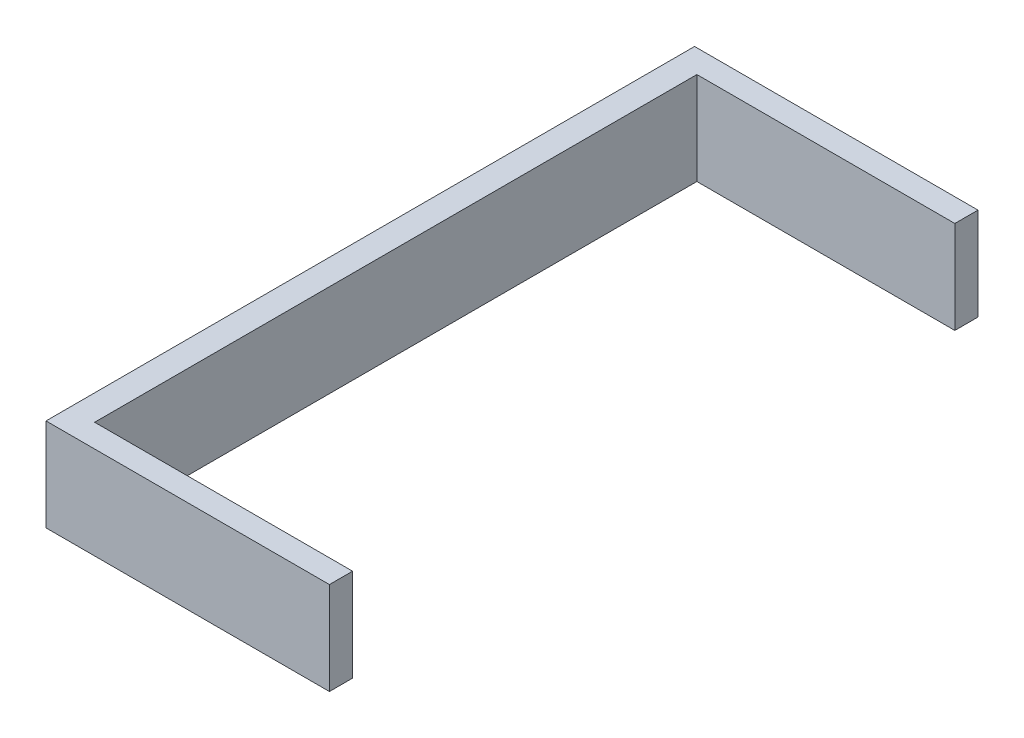
ISO-10303-21;
HEADER;
FILE_DESCRIPTION(('STEP AP214'),'2;1');
FILE_NAME('part.step','',(''),(''),'','','');
FILE_SCHEMA(('AUTOMOTIVE_DESIGN { 1 0 10303 214 1 1 1 1 }'));
ENDSEC;
DATA;
#1=APPLICATION_CONTEXT('core data for automotive mechanical design processes');
#2=APPLICATION_PROTOCOL_DEFINITION('international standard','automotive_design',2000,#1);
#3=PRODUCT_CONTEXT('',#1,'mechanical');
#4=PRODUCT('Part','Part','',(#3));
#5=PRODUCT_RELATED_PRODUCT_CATEGORY('part','',(#4));
#6=PRODUCT_DEFINITION_FORMATION('','',#4);
#7=PRODUCT_DEFINITION_CONTEXT('part definition',#1,'design');
#8=PRODUCT_DEFINITION('design','',#6,#7);
#9=PRODUCT_DEFINITION_SHAPE('','',#8);
#10=(LENGTH_UNIT() NAMED_UNIT(*) SI_UNIT(.MILLI.,.METRE.));
#11=(NAMED_UNIT(*) PLANE_ANGLE_UNIT() SI_UNIT($,.RADIAN.));
#12=(NAMED_UNIT(*) SI_UNIT($,.STERADIAN.) SOLID_ANGLE_UNIT());
#13=UNCERTAINTY_MEASURE_WITH_UNIT(LENGTH_MEASURE(1.E-05),#10,'distance_accuracy_value','');
#14=(GEOMETRIC_REPRESENTATION_CONTEXT(3) GLOBAL_UNCERTAINTY_ASSIGNED_CONTEXT((#13)) GLOBAL_UNIT_ASSIGNED_CONTEXT((#10,
#11,#12)) REPRESENTATION_CONTEXT('',''));
#15=CARTESIAN_POINT('',(0.,0.,0.));
#16=DIRECTION('',(0.,0.,1.));
#17=DIRECTION('',(1.,0.,0.));
#18=AXIS2_PLACEMENT_3D('',#15,#16,#17);
#19=CARTESIAN_POINT('',(35.3568,25.4,88.9));
#20=DIRECTION('',(-1.,0.,0.));
#21=DIRECTION('',(0.,0.,1.));
#22=AXIS2_PLACEMENT_3D('',#19,#20,#21);
#23=PLANE('',#22);
#24=DIRECTION('',(0.,0.,-1.));
#25=VECTOR('',#24,1.);
#26=CARTESIAN_POINT('',(35.3568,0.,88.9));
#27=LINE('',#26,#25);
#28=CARTESIAN_POINT('',(35.3568,0.,88.9));
#29=VERTEX_POINT('',#28);
#30=CARTESIAN_POINT('',(35.3568,0.,82.55));
#31=VERTEX_POINT('',#30);
#32=EDGE_CURVE('E129',#29,#31,#27,.T.);
#33=ORIENTED_EDGE('',*,*,#32,.T.);
#34=DIRECTION('',(0.,-1.,0.));
#35=VECTOR('',#34,1.);
#36=CARTESIAN_POINT('',(35.3568,25.4,82.55));
#37=LINE('',#36,#35);
#38=CARTESIAN_POINT('',(35.3568,25.4,82.55));
#39=VERTEX_POINT('',#38);
#40=EDGE_CURVE('E11',#39,#31,#37,.T.);
#41=ORIENTED_EDGE('',*,*,#40,.F.);
#42=DIRECTION('',(0.,0.,-1.));
#43=VECTOR('',#42,1.);
#44=CARTESIAN_POINT('',(35.3568,25.4,88.9));
#45=LINE('',#44,#43);
#46=CARTESIAN_POINT('',(35.3568,25.4,88.9));
#47=VERTEX_POINT('',#46);
#48=EDGE_CURVE('E143',#47,#39,#45,.T.);
#49=ORIENTED_EDGE('',*,*,#48,.F.);
#50=DIRECTION('',(0.,-1.,0.));
#51=VECTOR('',#50,1.);
#52=CARTESIAN_POINT('',(35.3568,25.4,88.9));
#53=LINE('',#52,#51);
#54=EDGE_CURVE('E125',#47,#29,#53,.T.);
#55=ORIENTED_EDGE('',*,*,#54,.T.);
#56=EDGE_LOOP('',(#33,#41,#49,#55));
#57=FACE_BOUND('',#56,.T.);
#58=ADVANCED_FACE('F33',(#57),#23,.F.);
#59=CARTESIAN_POINT('',(35.3568,25.4,82.55));
#60=DIRECTION('',(0.,0.,1.));
#61=DIRECTION('',(1.,0.,0.));
#62=AXIS2_PLACEMENT_3D('',#59,#60,#61);
#63=PLANE('',#62);
#64=DIRECTION('',(-1.,0.,0.));
#65=VECTOR('',#64,1.);
#66=CARTESIAN_POINT('',(35.3568,0.,82.55));
#67=LINE('',#66,#65);
#68=CARTESIAN_POINT('',(-35.3568,0.,82.55));
#69=VERTEX_POINT('',#68);
#70=EDGE_CURVE('E132',#31,#69,#67,.T.);
#71=ORIENTED_EDGE('',*,*,#70,.T.);
#72=DIRECTION('',(0.,-1.,0.));
#73=VECTOR('',#72,1.);
#74=CARTESIAN_POINT('',(-35.3568,25.4,82.55));
#75=LINE('',#74,#73);
#76=CARTESIAN_POINT('',(-35.3568,25.4,82.55));
#77=VERTEX_POINT('',#76);
#78=EDGE_CURVE('E41',#77,#69,#75,.T.);
#79=ORIENTED_EDGE('',*,*,#78,.F.);
#80=DIRECTION('',(-1.,0.,0.));
#81=VECTOR('',#80,1.);
#82=CARTESIAN_POINT('',(35.3568,25.4,82.55));
#83=LINE('',#82,#81);
#84=EDGE_CURVE('E92',#39,#77,#83,.T.);
#85=ORIENTED_EDGE('',*,*,#84,.F.);
#86=ORIENTED_EDGE('',*,*,#40,.T.);
#87=EDGE_LOOP('',(#71,#79,#85,#86));
#88=FACE_BOUND('',#87,.T.);
#89=ADVANCED_FACE('F178',(#88),#63,.F.);
#90=CARTESIAN_POINT('',(-35.3568,25.4,82.55));
#91=DIRECTION('',(-1.,0.,0.));
#92=DIRECTION('',(0.,0.,1.));
#93=AXIS2_PLACEMENT_3D('',#90,#91,#92);
#94=PLANE('',#93);
#95=DIRECTION('',(0.,0.,-1.));
#96=VECTOR('',#95,1.);
#97=CARTESIAN_POINT('',(-35.3568,0.,82.55));
#98=LINE('',#97,#96);
#99=CARTESIAN_POINT('',(-35.3568,0.,-82.55));
#100=VERTEX_POINT('',#99);
#101=EDGE_CURVE('E134',#69,#100,#98,.T.);
#102=ORIENTED_EDGE('',*,*,#101,.T.);
#103=DIRECTION('',(0.,-1.,0.));
#104=VECTOR('',#103,1.);
#105=CARTESIAN_POINT('',(-35.3568,25.4,-82.55));
#106=LINE('',#105,#104);
#107=CARTESIAN_POINT('',(-35.3568,25.4,-82.55));
#108=VERTEX_POINT('',#107);
#109=EDGE_CURVE('E150',#108,#100,#106,.T.);
#110=ORIENTED_EDGE('',*,*,#109,.F.);
#111=DIRECTION('',(0.,0.,-1.));
#112=VECTOR('',#111,1.);
#113=CARTESIAN_POINT('',(-35.3568,25.4,82.55));
#114=LINE('',#113,#112);
#115=EDGE_CURVE('E158',#77,#108,#114,.T.);
#116=ORIENTED_EDGE('',*,*,#115,.F.);
#117=ORIENTED_EDGE('',*,*,#78,.T.);
#118=EDGE_LOOP('',(#102,#110,#116,#117));
#119=FACE_BOUND('',#118,.T.);
#120=ADVANCED_FACE('F156',(#119),#94,.F.);
#121=CARTESIAN_POINT('',(-35.3568,25.4,-82.55));
#122=DIRECTION('',(0.,0.,-1.));
#123=DIRECTION('',(-1.,0.,0.));
#124=AXIS2_PLACEMENT_3D('',#121,#122,#123);
#125=PLANE('',#124);
#126=DIRECTION('',(1.,0.,0.));
#127=VECTOR('',#126,1.);
#128=CARTESIAN_POINT('',(-35.3568,0.,-82.55));
#129=LINE('',#128,#127);
#130=CARTESIAN_POINT('',(35.3568,0.,-82.55));
#131=VERTEX_POINT('',#130);
#132=EDGE_CURVE('E136',#100,#131,#129,.T.);
#133=ORIENTED_EDGE('',*,*,#132,.T.);
#134=DIRECTION('',(0.,-1.,0.));
#135=VECTOR('',#134,1.);
#136=CARTESIAN_POINT('',(35.3568,25.4,-82.55));
#137=LINE('',#136,#135);
#138=CARTESIAN_POINT('',(35.3568,25.4,-82.55));
#139=VERTEX_POINT('',#138);
#140=EDGE_CURVE('E147',#139,#131,#137,.T.);
#141=ORIENTED_EDGE('',*,*,#140,.F.);
#142=DIRECTION('',(1.,0.,0.));
#143=VECTOR('',#142,1.);
#144=CARTESIAN_POINT('',(-35.3568,25.4,-82.55));
#145=LINE('',#144,#143);
#146=EDGE_CURVE('E170',#108,#139,#145,.T.);
#147=ORIENTED_EDGE('',*,*,#146,.F.);
#148=ORIENTED_EDGE('',*,*,#109,.T.);
#149=EDGE_LOOP('',(#133,#141,#147,#148));
#150=FACE_BOUND('',#149,.T.);
#151=ADVANCED_FACE('F166',(#150),#125,.F.);
#152=CARTESIAN_POINT('',(35.3568,25.4,-82.55));
#153=DIRECTION('',(-1.,0.,0.));
#154=DIRECTION('',(0.,0.,1.));
#155=AXIS2_PLACEMENT_3D('',#152,#153,#154);
#156=PLANE('',#155);
#157=DIRECTION('',(0.,0.,-1.));
#158=VECTOR('',#157,1.);
#159=CARTESIAN_POINT('',(35.3568,0.,-82.55));
#160=LINE('',#159,#158);
#161=CARTESIAN_POINT('',(35.3568,0.,-88.9));
#162=VERTEX_POINT('',#161);
#163=EDGE_CURVE('E138',#131,#162,#160,.T.);
#164=ORIENTED_EDGE('',*,*,#163,.T.);
#165=DIRECTION('',(0.,-1.,0.));
#166=VECTOR('',#165,1.);
#167=CARTESIAN_POINT('',(35.3568,25.4,-88.9));
#168=LINE('',#167,#166);
#169=CARTESIAN_POINT('',(35.3568,25.4,-88.9));
#170=VERTEX_POINT('',#169);
#171=EDGE_CURVE('E120',#170,#162,#168,.T.);
#172=ORIENTED_EDGE('',*,*,#171,.F.);
#173=DIRECTION('',(0.,0.,-1.));
#174=VECTOR('',#173,1.);
#175=CARTESIAN_POINT('',(35.3568,25.4,-82.55));
#176=LINE('',#175,#174);
#177=EDGE_CURVE('E111',#139,#170,#176,.T.);
#178=ORIENTED_EDGE('',*,*,#177,.F.);
#179=ORIENTED_EDGE('',*,*,#140,.T.);
#180=EDGE_LOOP('',(#164,#172,#178,#179));
#181=FACE_BOUND('',#180,.T.);
#182=ADVANCED_FACE('F169',(#181),#156,.F.);
#183=CARTESIAN_POINT('',(35.3568,25.4,-88.9));
#184=DIRECTION('',(0.,0.,1.));
#185=DIRECTION('',(1.,0.,0.));
#186=AXIS2_PLACEMENT_3D('',#183,#184,#185);
#187=PLANE('',#186);
#188=DIRECTION('',(-1.,0.,0.));
#189=VECTOR('',#188,1.);
#190=CARTESIAN_POINT('',(35.3568,0.,-88.9));
#191=LINE('',#190,#189);
#192=CARTESIAN_POINT('',(-42.3418,0.,-88.9));
#193=VERTEX_POINT('',#192);
#194=EDGE_CURVE('E119',#162,#193,#191,.T.);
#195=ORIENTED_EDGE('',*,*,#194,.T.);
#196=DIRECTION('',(0.,-1.,0.));
#197=VECTOR('',#196,1.);
#198=CARTESIAN_POINT('',(-42.3418,25.4,-88.9));
#199=LINE('',#198,#197);
#200=CARTESIAN_POINT('',(-42.3418,25.4,-88.9));
#201=VERTEX_POINT('',#200);
#202=EDGE_CURVE('E116',#201,#193,#199,.T.);
#203=ORIENTED_EDGE('',*,*,#202,.F.);
#204=DIRECTION('',(-1.,0.,0.));
#205=VECTOR('',#204,1.);
#206=CARTESIAN_POINT('',(35.3568,25.4,-88.9));
#207=LINE('',#206,#205);
#208=EDGE_CURVE('E105',#170,#201,#207,.T.);
#209=ORIENTED_EDGE('',*,*,#208,.F.);
#210=ORIENTED_EDGE('',*,*,#171,.T.);
#211=EDGE_LOOP('',(#195,#203,#209,#210));
#212=FACE_BOUND('',#211,.T.);
#213=ADVANCED_FACE('F117',(#212),#187,.F.);
#214=CARTESIAN_POINT('',(-42.3418,25.4,-88.9));
#215=DIRECTION('',(1.,0.,0.));
#216=DIRECTION('',(0.,0.,-1.));
#217=AXIS2_PLACEMENT_3D('',#214,#215,#216);
#218=PLANE('',#217);
#219=DIRECTION('',(0.,0.,1.));
#220=VECTOR('',#219,1.);
#221=CARTESIAN_POINT('',(-42.3418,0.,-88.9));
#222=LINE('',#221,#220);
#223=CARTESIAN_POINT('',(-42.3418,0.,88.9));
#224=VERTEX_POINT('',#223);
#225=EDGE_CURVE('E78',#193,#224,#222,.T.);
#226=ORIENTED_EDGE('',*,*,#225,.T.);
#227=DIRECTION('',(0.,-1.,0.));
#228=VECTOR('',#227,1.);
#229=CARTESIAN_POINT('',(-42.3418,25.4,88.9));
#230=LINE('',#229,#228);
#231=CARTESIAN_POINT('',(-42.3418,25.4,88.9));
#232=VERTEX_POINT('',#231);
#233=EDGE_CURVE('E121',#232,#224,#230,.T.);
#234=ORIENTED_EDGE('',*,*,#233,.F.);
#235=DIRECTION('',(0.,0.,1.));
#236=VECTOR('',#235,1.);
#237=CARTESIAN_POINT('',(-42.3418,25.4,-88.9));
#238=LINE('',#237,#236);
#239=EDGE_CURVE('E109',#201,#232,#238,.T.);
#240=ORIENTED_EDGE('',*,*,#239,.F.);
#241=ORIENTED_EDGE('',*,*,#202,.T.);
#242=EDGE_LOOP('',(#226,#234,#240,#241));
#243=FACE_BOUND('',#242,.T.);
#244=ADVANCED_FACE('F123',(#243),#218,.F.);
#245=CARTESIAN_POINT('',(-42.3418,25.4,88.9));
#246=DIRECTION('',(0.,0.,-1.));
#247=DIRECTION('',(-1.,0.,0.));
#248=AXIS2_PLACEMENT_3D('',#245,#246,#247);
#249=PLANE('',#248);
#250=DIRECTION('',(1.,0.,0.));
#251=VECTOR('',#250,1.);
#252=CARTESIAN_POINT('',(-42.3418,0.,88.9));
#253=LINE('',#252,#251);
#254=EDGE_CURVE('E84',#224,#29,#253,.T.);
#255=ORIENTED_EDGE('',*,*,#254,.T.);
#256=ORIENTED_EDGE('',*,*,#54,.F.);
#257=DIRECTION('',(1.,0.,0.));
#258=VECTOR('',#257,1.);
#259=CARTESIAN_POINT('',(-42.3418,25.4,88.9));
#260=LINE('',#259,#258);
#261=EDGE_CURVE('E49',#232,#47,#260,.T.);
#262=ORIENTED_EDGE('',*,*,#261,.F.);
#263=ORIENTED_EDGE('',*,*,#233,.T.);
#264=EDGE_LOOP('',(#255,#256,#262,#263));
#265=FACE_BOUND('',#264,.T.);
#266=ADVANCED_FACE('F194',(#265),#249,.F.);
#267=CARTESIAN_POINT('',(0.,25.4,0.));
#268=DIRECTION('',(0.,1.,0.));
#269=DIRECTION('',(0.,0.,1.));
#270=AXIS2_PLACEMENT_3D('',#267,#268,#269);
#271=PLANE('',#270);
#272=ORIENTED_EDGE('',*,*,#48,.T.);
#273=ORIENTED_EDGE('',*,*,#84,.T.);
#274=ORIENTED_EDGE('',*,*,#115,.T.);
#275=ORIENTED_EDGE('',*,*,#146,.T.);
#276=ORIENTED_EDGE('',*,*,#177,.T.);
#277=ORIENTED_EDGE('',*,*,#208,.T.);
#278=ORIENTED_EDGE('',*,*,#239,.T.);
#279=ORIENTED_EDGE('',*,*,#261,.T.);
#280=EDGE_LOOP('',(#272,#273,#274,#275,#276,#277,#278,#279));
#281=FACE_BOUND('',#280,.T.);
#282=ADVANCED_FACE('F107',(#281),#271,.T.);
#283=CARTESIAN_POINT('',(0.,0.,0.));
#284=DIRECTION('',(0.,1.,0.));
#285=DIRECTION('',(0.,0.,1.));
#286=AXIS2_PLACEMENT_3D('',#283,#284,#285);
#287=PLANE('',#286);
#288=ORIENTED_EDGE('',*,*,#32,.F.);
#289=ORIENTED_EDGE('',*,*,#254,.F.);
#290=ORIENTED_EDGE('',*,*,#225,.F.);
#291=ORIENTED_EDGE('',*,*,#194,.F.);
#292=ORIENTED_EDGE('',*,*,#163,.F.);
#293=ORIENTED_EDGE('',*,*,#132,.F.);
#294=ORIENTED_EDGE('',*,*,#101,.F.);
#295=ORIENTED_EDGE('',*,*,#70,.F.);
#296=EDGE_LOOP('',(#288,#289,#290,#291,#292,#293,#294,#295));
#297=FACE_BOUND('',#296,.T.);
#298=ADVANCED_FACE('F162',(#297),#287,.F.);
#299=CLOSED_SHELL('',(#58,#89,#120,#151,#182,#213,#244,#266,#282,#298));
#300=MANIFOLD_SOLID_BREP('B2',#299);
#301=ADVANCED_BREP_SHAPE_REPRESENTATION('',(#18,#300),#14);
#302=SHAPE_DEFINITION_REPRESENTATION(#9,#301);
ENDSEC;
END-ISO-10303-21;
